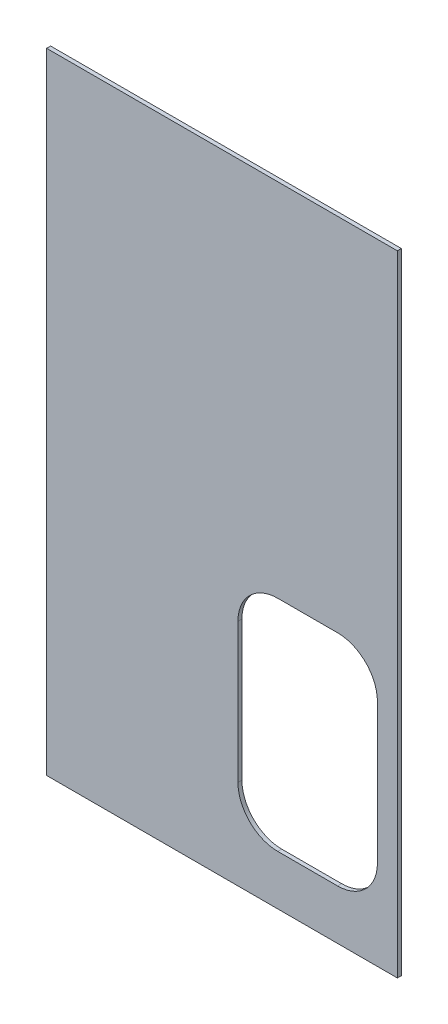
ISO-10303-21;
HEADER;
FILE_DESCRIPTION(('STEP AP214'),'2;1');
FILE_NAME('part.step','',(''),(''),'','','');
FILE_SCHEMA(('AUTOMOTIVE_DESIGN { 1 0 10303 214 1 1 1 1 }'));
ENDSEC;
DATA;
#1=APPLICATION_CONTEXT('core data for automotive mechanical design processes');
#2=APPLICATION_PROTOCOL_DEFINITION('international standard','automotive_design',2000,#1);
#3=PRODUCT_CONTEXT('',#1,'mechanical');
#4=PRODUCT('Part','Part','',(#3));
#5=PRODUCT_RELATED_PRODUCT_CATEGORY('part','',(#4));
#6=PRODUCT_DEFINITION_FORMATION('','',#4);
#7=PRODUCT_DEFINITION_CONTEXT('part definition',#1,'design');
#8=PRODUCT_DEFINITION('design','',#6,#7);
#9=PRODUCT_DEFINITION_SHAPE('','',#8);
#10=(LENGTH_UNIT() NAMED_UNIT(*) SI_UNIT(.MILLI.,.METRE.));
#11=(NAMED_UNIT(*) PLANE_ANGLE_UNIT() SI_UNIT($,.RADIAN.));
#12=(NAMED_UNIT(*) SI_UNIT($,.STERADIAN.) SOLID_ANGLE_UNIT());
#13=UNCERTAINTY_MEASURE_WITH_UNIT(LENGTH_MEASURE(1.E-05),#10,'distance_accuracy_value','');
#14=(GEOMETRIC_REPRESENTATION_CONTEXT(3) GLOBAL_UNCERTAINTY_ASSIGNED_CONTEXT((#13)) GLOBAL_UNIT_ASSIGNED_CONTEXT((#10,
#11,#12)) REPRESENTATION_CONTEXT('',''));
#15=CARTESIAN_POINT('',(0.,0.,0.));
#16=DIRECTION('',(0.,0.,1.));
#17=DIRECTION('',(1.,0.,0.));
#18=AXIS2_PLACEMENT_3D('',#15,#16,#17);
#19=CARTESIAN_POINT('',(0.,0.,2.));
#20=DIRECTION('',(0.,0.,-1.));
#21=DIRECTION('',(-1.,0.,0.));
#22=AXIS2_PLACEMENT_3D('',#19,#20,#21);
#23=PLANE('',#22);
#24=DIRECTION('',(0.,-1.,0.));
#25=VECTOR('',#24,1.);
#26=CARTESIAN_POINT('',(0.,0.,2.));
#27=LINE('',#26,#25);
#28=CARTESIAN_POINT('',(0.,316.,2.));
#29=VERTEX_POINT('',#28);
#30=CARTESIAN_POINT('',(0.,0.,2.));
#31=VERTEX_POINT('',#30);
#32=EDGE_CURVE('E138',#29,#31,#27,.T.);
#33=ORIENTED_EDGE('',*,*,#32,.T.);
#34=DIRECTION('',(1.,0.,0.));
#35=VECTOR('',#34,1.);
#36=CARTESIAN_POINT('',(0.,0.,2.));
#37=LINE('',#36,#35);
#38=CARTESIAN_POINT('',(176.,0.,2.));
#39=VERTEX_POINT('',#38);
#40=EDGE_CURVE('E127',#31,#39,#37,.T.);
#41=ORIENTED_EDGE('',*,*,#40,.T.);
#42=DIRECTION('',(0.,1.,0.));
#43=VECTOR('',#42,1.);
#44=CARTESIAN_POINT('',(176.,0.,2.));
#45=LINE('',#44,#43);
#46=CARTESIAN_POINT('',(176.,316.,2.));
#47=VERTEX_POINT('',#46);
#48=EDGE_CURVE('E137',#39,#47,#45,.T.);
#49=ORIENTED_EDGE('',*,*,#48,.T.);
#50=DIRECTION('',(-1.,0.,0.));
#51=VECTOR('',#50,1.);
#52=CARTESIAN_POINT('',(0.,316.,2.));
#53=LINE('',#52,#51);
#54=EDGE_CURVE('E142',#47,#29,#53,.T.);
#55=ORIENTED_EDGE('',*,*,#54,.T.);
#56=EDGE_LOOP('',(#33,#41,#49,#55));
#57=FACE_BOUND('',#56,.T.);
#58=DIRECTION('',(0.,1.,0.));
#59=VECTOR('',#58,1.);
#60=CARTESIAN_POINT('',(166.,25.,2.));
#61=LINE('',#60,#59);
#62=CARTESIAN_POINT('',(166.,45.,2.));
#63=VERTEX_POINT('',#62);
#64=CARTESIAN_POINT('',(166.,115.,2.));
#65=VERTEX_POINT('',#64);
#66=EDGE_CURVE('E196',#63,#65,#61,.T.);
#67=ORIENTED_EDGE('',*,*,#66,.F.);
#68=CARTESIAN_POINT('',(146.,45.,2.));
#69=DIRECTION('',(0.,0.,-1.));
#70=DIRECTION('',(-1.,0.,0.));
#71=AXIS2_PLACEMENT_3D('',#68,#69,#70);
#72=CIRCLE('',#71,20.);
#73=CARTESIAN_POINT('',(146.,25.,2.));
#74=VERTEX_POINT('',#73);
#75=EDGE_CURVE('E52',#63,#74,#72,.T.);
#76=ORIENTED_EDGE('',*,*,#75,.T.);
#77=DIRECTION('',(1.,0.,0.));
#78=VECTOR('',#77,1.);
#79=CARTESIAN_POINT('',(166.,25.,2.));
#80=LINE('',#79,#78);
#81=CARTESIAN_POINT('',(116.,25.,2.));
#82=VERTEX_POINT('',#81);
#83=EDGE_CURVE('E203',#82,#74,#80,.T.);
#84=ORIENTED_EDGE('',*,*,#83,.F.);
#85=CARTESIAN_POINT('',(116.,45.,2.));
#86=DIRECTION('',(0.,0.,-1.));
#87=DIRECTION('',(-1.,0.,0.));
#88=AXIS2_PLACEMENT_3D('',#85,#86,#87);
#89=CIRCLE('',#88,20.);
#90=CARTESIAN_POINT('',(96.,45.,2.));
#91=VERTEX_POINT('',#90);
#92=EDGE_CURVE('E11',#82,#91,#89,.T.);
#93=ORIENTED_EDGE('',*,*,#92,.T.);
#94=DIRECTION('',(0.,-1.,0.));
#95=VECTOR('',#94,1.);
#96=CARTESIAN_POINT('',(96.,25.,2.));
#97=LINE('',#96,#95);
#98=CARTESIAN_POINT('',(96.,115.,2.));
#99=VERTEX_POINT('',#98);
#100=EDGE_CURVE('E201',#99,#91,#97,.T.);
#101=ORIENTED_EDGE('',*,*,#100,.F.);
#102=CARTESIAN_POINT('',(116.,115.,2.));
#103=DIRECTION('',(0.,0.,-1.));
#104=DIRECTION('',(-1.,0.,0.));
#105=AXIS2_PLACEMENT_3D('',#102,#103,#104);
#106=CIRCLE('',#105,20.);
#107=CARTESIAN_POINT('',(116.,135.,2.));
#108=VERTEX_POINT('',#107);
#109=EDGE_CURVE('E177',#99,#108,#106,.T.);
#110=ORIENTED_EDGE('',*,*,#109,.T.);
#111=DIRECTION('',(-1.,0.,0.));
#112=VECTOR('',#111,1.);
#113=CARTESIAN_POINT('',(166.,135.,2.));
#114=LINE('',#113,#112);
#115=CARTESIAN_POINT('',(146.,135.,2.));
#116=VERTEX_POINT('',#115);
#117=EDGE_CURVE('E207',#116,#108,#114,.T.);
#118=ORIENTED_EDGE('',*,*,#117,.F.);
#119=CARTESIAN_POINT('',(146.,115.,2.));
#120=DIRECTION('',(0.,0.,-1.));
#121=DIRECTION('',(-1.,0.,0.));
#122=AXIS2_PLACEMENT_3D('',#119,#120,#121);
#123=CIRCLE('',#122,20.);
#124=EDGE_CURVE('E181',#116,#65,#123,.T.);
#125=ORIENTED_EDGE('',*,*,#124,.T.);
#126=EDGE_LOOP('',(#67,#76,#84,#93,#101,#110,#118,#125));
#127=FACE_BOUND('',#126,.T.);
#128=ADVANCED_FACE('F37',(#57,#127),#23,.F.);
#129=CARTESIAN_POINT('',(0.,0.,0.));
#130=DIRECTION('',(0.,0.,-1.));
#131=DIRECTION('',(-1.,0.,0.));
#132=AXIS2_PLACEMENT_3D('',#129,#130,#131);
#133=PLANE('',#132);
#134=DIRECTION('',(0.,-1.,0.));
#135=VECTOR('',#134,1.);
#136=CARTESIAN_POINT('',(0.,0.,0.));
#137=LINE('',#136,#135);
#138=CARTESIAN_POINT('',(0.,316.,0.));
#139=VERTEX_POINT('',#138);
#140=CARTESIAN_POINT('',(0.,0.,0.));
#141=VERTEX_POINT('',#140);
#142=EDGE_CURVE('E150',#139,#141,#137,.T.);
#143=ORIENTED_EDGE('',*,*,#142,.F.);
#144=DIRECTION('',(-1.,0.,0.));
#145=VECTOR('',#144,1.);
#146=CARTESIAN_POINT('',(0.,316.,0.));
#147=LINE('',#146,#145);
#148=CARTESIAN_POINT('',(176.,316.,0.));
#149=VERTEX_POINT('',#148);
#150=EDGE_CURVE('E146',#149,#139,#147,.T.);
#151=ORIENTED_EDGE('',*,*,#150,.F.);
#152=DIRECTION('',(0.,1.,0.));
#153=VECTOR('',#152,1.);
#154=CARTESIAN_POINT('',(176.,0.,0.));
#155=LINE('',#154,#153);
#156=CARTESIAN_POINT('',(176.,0.,0.));
#157=VERTEX_POINT('',#156);
#158=EDGE_CURVE('E227',#157,#149,#155,.T.);
#159=ORIENTED_EDGE('',*,*,#158,.F.);
#160=DIRECTION('',(1.,0.,0.));
#161=VECTOR('',#160,1.);
#162=CARTESIAN_POINT('',(0.,0.,0.));
#163=LINE('',#162,#161);
#164=EDGE_CURVE('E225',#141,#157,#163,.T.);
#165=ORIENTED_EDGE('',*,*,#164,.F.);
#166=EDGE_LOOP('',(#143,#151,#159,#165));
#167=FACE_BOUND('',#166,.T.);
#168=DIRECTION('',(0.,-1.,0.));
#169=VECTOR('',#168,1.);
#170=CARTESIAN_POINT('',(96.,25.,0.));
#171=LINE('',#170,#169);
#172=CARTESIAN_POINT('',(96.,115.,0.));
#173=VERTEX_POINT('',#172);
#174=CARTESIAN_POINT('',(96.,45.,0.));
#175=VERTEX_POINT('',#174);
#176=EDGE_CURVE('E191',#173,#175,#171,.T.);
#177=ORIENTED_EDGE('',*,*,#176,.T.);
#178=CARTESIAN_POINT('',(116.,45.,0.));
#179=DIRECTION('',(0.,0.,-1.));
#180=DIRECTION('',(-1.,0.,0.));
#181=AXIS2_PLACEMENT_3D('',#178,#179,#180);
#182=CIRCLE('',#181,20.);
#183=CARTESIAN_POINT('',(116.,25.,0.));
#184=VERTEX_POINT('',#183);
#185=EDGE_CURVE('E45',#175,#184,#182,.F.);
#186=ORIENTED_EDGE('',*,*,#185,.T.);
#187=DIRECTION('',(1.,0.,0.));
#188=VECTOR('',#187,1.);
#189=CARTESIAN_POINT('',(166.,25.,0.));
#190=LINE('',#189,#188);
#191=CARTESIAN_POINT('',(146.,25.,0.));
#192=VERTEX_POINT('',#191);
#193=EDGE_CURVE('E189',#184,#192,#190,.T.);
#194=ORIENTED_EDGE('',*,*,#193,.T.);
#195=CARTESIAN_POINT('',(146.,45.,0.));
#196=DIRECTION('',(0.,0.,-1.));
#197=DIRECTION('',(-1.,0.,0.));
#198=AXIS2_PLACEMENT_3D('',#195,#196,#197);
#199=CIRCLE('',#198,20.);
#200=CARTESIAN_POINT('',(166.,45.,0.));
#201=VERTEX_POINT('',#200);
#202=EDGE_CURVE('E183',#192,#201,#199,.F.);
#203=ORIENTED_EDGE('',*,*,#202,.T.);
#204=DIRECTION('',(0.,1.,0.));
#205=VECTOR('',#204,1.);
#206=CARTESIAN_POINT('',(166.,25.,0.));
#207=LINE('',#206,#205);
#208=CARTESIAN_POINT('',(166.,115.,0.));
#209=VERTEX_POINT('',#208);
#210=EDGE_CURVE('E214',#201,#209,#207,.T.);
#211=ORIENTED_EDGE('',*,*,#210,.T.);
#212=CARTESIAN_POINT('',(146.,115.,0.));
#213=DIRECTION('',(0.,0.,-1.));
#214=DIRECTION('',(-1.,0.,0.));
#215=AXIS2_PLACEMENT_3D('',#212,#213,#214);
#216=CIRCLE('',#215,20.);
#217=CARTESIAN_POINT('',(146.,135.,0.));
#218=VERTEX_POINT('',#217);
#219=EDGE_CURVE('E179',#209,#218,#216,.F.);
#220=ORIENTED_EDGE('',*,*,#219,.T.);
#221=DIRECTION('',(-1.,0.,0.));
#222=VECTOR('',#221,1.);
#223=CARTESIAN_POINT('',(166.,135.,0.));
#224=LINE('',#223,#222);
#225=CARTESIAN_POINT('',(116.,135.,0.));
#226=VERTEX_POINT('',#225);
#227=EDGE_CURVE('E217',#218,#226,#224,.T.);
#228=ORIENTED_EDGE('',*,*,#227,.T.);
#229=CARTESIAN_POINT('',(116.,115.,0.));
#230=DIRECTION('',(0.,0.,-1.));
#231=DIRECTION('',(-1.,0.,0.));
#232=AXIS2_PLACEMENT_3D('',#229,#230,#231);
#233=CIRCLE('',#232,20.);
#234=EDGE_CURVE('E175',#226,#173,#233,.F.);
#235=ORIENTED_EDGE('',*,*,#234,.T.);
#236=EDGE_LOOP('',(#177,#186,#194,#203,#211,#220,#228,#235));
#237=FACE_BOUND('',#236,.T.);
#238=ADVANCED_FACE('F188',(#167,#237),#133,.T.);
#239=CARTESIAN_POINT('',(0.,0.,2.));
#240=DIRECTION('',(1.,0.,0.));
#241=DIRECTION('',(0.,0.,-1.));
#242=AXIS2_PLACEMENT_3D('',#239,#240,#241);
#243=PLANE('',#242);
#244=ORIENTED_EDGE('',*,*,#142,.T.);
#245=DIRECTION('',(0.,0.,-1.));
#246=VECTOR('',#245,1.);
#247=CARTESIAN_POINT('',(0.,0.,2.));
#248=LINE('',#247,#246);
#249=EDGE_CURVE('E131',#31,#141,#248,.T.);
#250=ORIENTED_EDGE('',*,*,#249,.F.);
#251=ORIENTED_EDGE('',*,*,#32,.F.);
#252=DIRECTION('',(0.,0.,-1.));
#253=VECTOR('',#252,1.);
#254=CARTESIAN_POINT('',(0.,316.,2.));
#255=LINE('',#254,#253);
#256=EDGE_CURVE('E223',#29,#139,#255,.T.);
#257=ORIENTED_EDGE('',*,*,#256,.T.);
#258=EDGE_LOOP('',(#244,#250,#251,#257));
#259=FACE_BOUND('',#258,.T.);
#260=ADVANCED_FACE('F148',(#259),#243,.F.);
#261=CARTESIAN_POINT('',(0.,0.,2.));
#262=DIRECTION('',(0.,1.,0.));
#263=DIRECTION('',(0.,0.,1.));
#264=AXIS2_PLACEMENT_3D('',#261,#262,#263);
#265=PLANE('',#264);
#266=ORIENTED_EDGE('',*,*,#164,.T.);
#267=DIRECTION('',(0.,0.,-1.));
#268=VECTOR('',#267,1.);
#269=CARTESIAN_POINT('',(176.,0.,2.));
#270=LINE('',#269,#268);
#271=EDGE_CURVE('E134',#39,#157,#270,.T.);
#272=ORIENTED_EDGE('',*,*,#271,.F.);
#273=ORIENTED_EDGE('',*,*,#40,.F.);
#274=ORIENTED_EDGE('',*,*,#249,.T.);
#275=EDGE_LOOP('',(#266,#272,#273,#274));
#276=FACE_BOUND('',#275,.T.);
#277=ADVANCED_FACE('F129',(#276),#265,.F.);
#278=CARTESIAN_POINT('',(176.,0.,2.));
#279=DIRECTION('',(-1.,0.,0.));
#280=DIRECTION('',(0.,0.,1.));
#281=AXIS2_PLACEMENT_3D('',#278,#279,#280);
#282=PLANE('',#281);
#283=ORIENTED_EDGE('',*,*,#158,.T.);
#284=DIRECTION('',(0.,0.,-1.));
#285=VECTOR('',#284,1.);
#286=CARTESIAN_POINT('',(176.,316.,2.));
#287=LINE('',#286,#285);
#288=EDGE_CURVE('E155',#47,#149,#287,.T.);
#289=ORIENTED_EDGE('',*,*,#288,.F.);
#290=ORIENTED_EDGE('',*,*,#48,.F.);
#291=ORIENTED_EDGE('',*,*,#271,.T.);
#292=EDGE_LOOP('',(#283,#289,#290,#291));
#293=FACE_BOUND('',#292,.T.);
#294=ADVANCED_FACE('F238',(#293),#282,.F.);
#295=CARTESIAN_POINT('',(0.,316.,2.));
#296=DIRECTION('',(0.,-1.,0.));
#297=DIRECTION('',(0.,0.,-1.));
#298=AXIS2_PLACEMENT_3D('',#295,#296,#297);
#299=PLANE('',#298);
#300=ORIENTED_EDGE('',*,*,#150,.T.);
#301=ORIENTED_EDGE('',*,*,#256,.F.);
#302=ORIENTED_EDGE('',*,*,#54,.F.);
#303=ORIENTED_EDGE('',*,*,#288,.T.);
#304=EDGE_LOOP('',(#300,#301,#302,#303));
#305=FACE_BOUND('',#304,.T.);
#306=ADVANCED_FACE('F234',(#305),#299,.F.);
#307=CARTESIAN_POINT('',(166.,25.,2.));
#308=DIRECTION('',(-1.,0.,0.));
#309=DIRECTION('',(0.,0.,1.));
#310=AXIS2_PLACEMENT_3D('',#307,#308,#309);
#311=PLANE('',#310);
#312=ORIENTED_EDGE('',*,*,#66,.T.);
#313=DIRECTION('',(0.,0.,-1.));
#314=VECTOR('',#313,1.);
#315=CARTESIAN_POINT('',(166.,115.,0.));
#316=LINE('',#315,#314);
#317=EDGE_CURVE('E168',#65,#209,#316,.T.);
#318=ORIENTED_EDGE('',*,*,#317,.T.);
#319=ORIENTED_EDGE('',*,*,#210,.F.);
#320=DIRECTION('',(0.,0.,-1.));
#321=VECTOR('',#320,1.);
#322=CARTESIAN_POINT('',(166.,45.,2.));
#323=LINE('',#322,#321);
#324=EDGE_CURVE('E166',#201,#63,#323,.F.);
#325=ORIENTED_EDGE('',*,*,#324,.T.);
#326=EDGE_LOOP('',(#312,#318,#319,#325));
#327=FACE_BOUND('',#326,.T.);
#328=ADVANCED_FACE('F245',(#327),#311,.T.);
#329=CARTESIAN_POINT('',(166.,135.,2.));
#330=DIRECTION('',(0.,-1.,0.));
#331=DIRECTION('',(0.,0.,-1.));
#332=AXIS2_PLACEMENT_3D('',#329,#330,#331);
#333=PLANE('',#332);
#334=ORIENTED_EDGE('',*,*,#117,.T.);
#335=DIRECTION('',(0.,0.,-1.));
#336=VECTOR('',#335,1.);
#337=CARTESIAN_POINT('',(116.,135.,0.));
#338=LINE('',#337,#336);
#339=EDGE_CURVE('E153',#108,#226,#338,.T.);
#340=ORIENTED_EDGE('',*,*,#339,.T.);
#341=ORIENTED_EDGE('',*,*,#227,.F.);
#342=DIRECTION('',(0.,0.,-1.));
#343=VECTOR('',#342,1.);
#344=CARTESIAN_POINT('',(146.,135.,2.));
#345=LINE('',#344,#343);
#346=EDGE_CURVE('E151',#218,#116,#345,.F.);
#347=ORIENTED_EDGE('',*,*,#346,.T.);
#348=EDGE_LOOP('',(#334,#340,#341,#347));
#349=FACE_BOUND('',#348,.T.);
#350=ADVANCED_FACE('F257',(#349),#333,.T.);
#351=CARTESIAN_POINT('',(96.,25.,2.));
#352=DIRECTION('',(1.,0.,0.));
#353=DIRECTION('',(0.,0.,-1.));
#354=AXIS2_PLACEMENT_3D('',#351,#352,#353);
#355=PLANE('',#354);
#356=ORIENTED_EDGE('',*,*,#176,.F.);
#357=DIRECTION('',(0.,0.,-1.));
#358=VECTOR('',#357,1.);
#359=CARTESIAN_POINT('',(96.,115.,2.));
#360=LINE('',#359,#358);
#361=EDGE_CURVE('E164',#173,#99,#360,.F.);
#362=ORIENTED_EDGE('',*,*,#361,.T.);
#363=ORIENTED_EDGE('',*,*,#100,.T.);
#364=DIRECTION('',(0.,0.,-1.));
#365=VECTOR('',#364,1.);
#366=CARTESIAN_POINT('',(96.,45.,0.));
#367=LINE('',#366,#365);
#368=EDGE_CURVE('E161',#91,#175,#367,.T.);
#369=ORIENTED_EDGE('',*,*,#368,.T.);
#370=EDGE_LOOP('',(#356,#362,#363,#369));
#371=FACE_BOUND('',#370,.T.);
#372=ADVANCED_FACE('F205',(#371),#355,.T.);
#373=CARTESIAN_POINT('',(166.,25.,2.));
#374=DIRECTION('',(0.,1.,0.));
#375=DIRECTION('',(-1.,0.,0.));
#376=AXIS2_PLACEMENT_3D('',#373,#374,#375);
#377=PLANE('',#376);
#378=ORIENTED_EDGE('',*,*,#83,.T.);
#379=DIRECTION('',(0.,0.,-1.));
#380=VECTOR('',#379,1.);
#381=CARTESIAN_POINT('',(146.,25.,0.));
#382=LINE('',#381,#380);
#383=EDGE_CURVE('E172',#74,#192,#382,.T.);
#384=ORIENTED_EDGE('',*,*,#383,.T.);
#385=ORIENTED_EDGE('',*,*,#193,.F.);
#386=DIRECTION('',(0.,0.,-1.));
#387=VECTOR('',#386,1.);
#388=CARTESIAN_POINT('',(116.,25.,2.));
#389=LINE('',#388,#387);
#390=EDGE_CURVE('E59',#184,#82,#389,.F.);
#391=ORIENTED_EDGE('',*,*,#390,.T.);
#392=EDGE_LOOP('',(#378,#384,#385,#391));
#393=FACE_BOUND('',#392,.T.);
#394=ADVANCED_FACE('F194',(#393),#377,.T.);
#395=CARTESIAN_POINT('',(116.,115.,2.));
#396=DIRECTION('',(0.,0.,1.));
#397=DIRECTION('',(1.,0.,0.));
#398=AXIS2_PLACEMENT_3D('',#395,#396,#397);
#399=CYLINDRICAL_SURFACE('',#398,20.);
#400=ORIENTED_EDGE('',*,*,#109,.F.);
#401=ORIENTED_EDGE('',*,*,#361,.F.);
#402=ORIENTED_EDGE('',*,*,#234,.F.);
#403=ORIENTED_EDGE('',*,*,#339,.F.);
#404=EDGE_LOOP('',(#400,#401,#402,#403));
#405=FACE_BOUND('',#404,.T.);
#406=ADVANCED_FACE('F265',(#405),#399,.F.);
#407=CARTESIAN_POINT('',(146.,115.,2.));
#408=DIRECTION('',(0.,0.,1.));
#409=DIRECTION('',(1.,0.,0.));
#410=AXIS2_PLACEMENT_3D('',#407,#408,#409);
#411=CYLINDRICAL_SURFACE('',#410,20.);
#412=ORIENTED_EDGE('',*,*,#124,.F.);
#413=ORIENTED_EDGE('',*,*,#346,.F.);
#414=ORIENTED_EDGE('',*,*,#219,.F.);
#415=ORIENTED_EDGE('',*,*,#317,.F.);
#416=EDGE_LOOP('',(#412,#413,#414,#415));
#417=FACE_BOUND('',#416,.T.);
#418=ADVANCED_FACE('F269',(#417),#411,.F.);
#419=CARTESIAN_POINT('',(146.,45.,2.));
#420=DIRECTION('',(0.,0.,1.));
#421=DIRECTION('',(1.,0.,0.));
#422=AXIS2_PLACEMENT_3D('',#419,#420,#421);
#423=CYLINDRICAL_SURFACE('',#422,20.);
#424=ORIENTED_EDGE('',*,*,#75,.F.);
#425=ORIENTED_EDGE('',*,*,#324,.F.);
#426=ORIENTED_EDGE('',*,*,#202,.F.);
#427=ORIENTED_EDGE('',*,*,#383,.F.);
#428=EDGE_LOOP('',(#424,#425,#426,#427));
#429=FACE_BOUND('',#428,.T.);
#430=ADVANCED_FACE('F275',(#429),#423,.F.);
#431=CARTESIAN_POINT('',(116.,45.,2.));
#432=DIRECTION('',(0.,0.,1.));
#433=DIRECTION('',(1.,0.,0.));
#434=AXIS2_PLACEMENT_3D('',#431,#432,#433);
#435=CYLINDRICAL_SURFACE('',#434,20.);
#436=ORIENTED_EDGE('',*,*,#92,.F.);
#437=ORIENTED_EDGE('',*,*,#390,.F.);
#438=ORIENTED_EDGE('',*,*,#185,.F.);
#439=ORIENTED_EDGE('',*,*,#368,.F.);
#440=EDGE_LOOP('',(#436,#437,#438,#439));
#441=FACE_BOUND('',#440,.T.);
#442=ADVANCED_FACE('F39',(#441),#435,.F.);
#443=CLOSED_SHELL('',(#128,#238,#260,#277,#294,#306,#328,#350,#372,#394,#406,#418,#430,#442));
#444=MANIFOLD_SOLID_BREP('B2',#443);
#445=ADVANCED_BREP_SHAPE_REPRESENTATION('',(#18,#444),#14);
#446=SHAPE_DEFINITION_REPRESENTATION(#9,#445);
ENDSEC;
END-ISO-10303-21;
